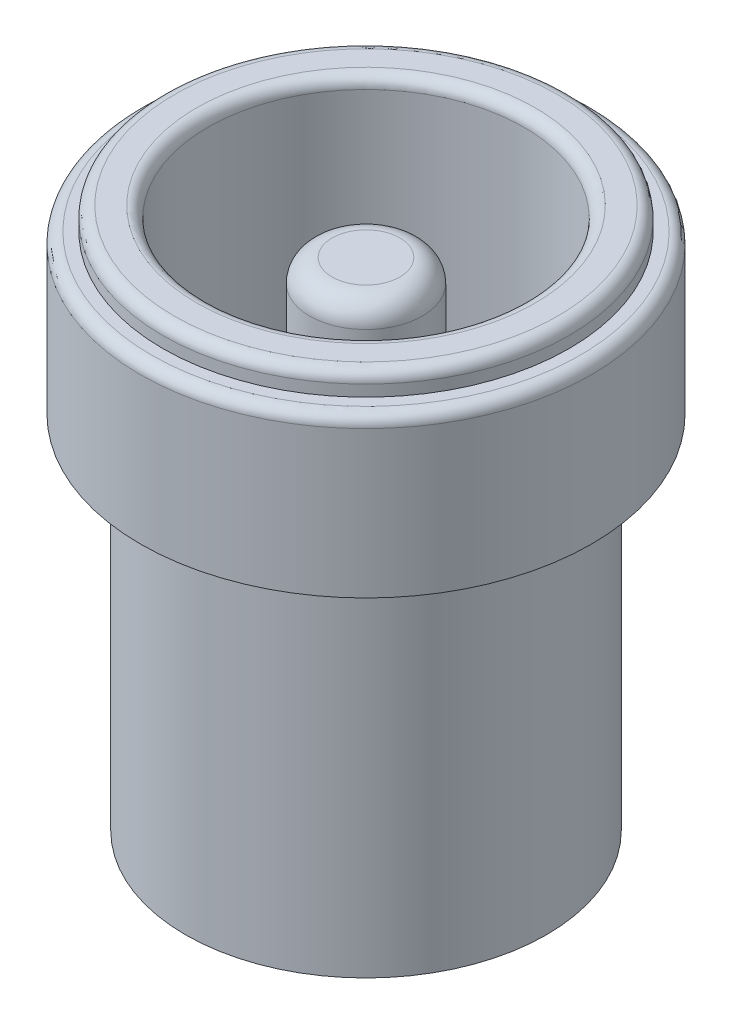
ISO-10303-21;
HEADER;
FILE_DESCRIPTION(('STEP AP214'),'2;1');
FILE_NAME('part.step','',(''),(''),'','','');
FILE_SCHEMA(('AUTOMOTIVE_DESIGN { 1 0 10303 214 1 1 1 1 }'));
ENDSEC;
DATA;
#1=APPLICATION_CONTEXT('core data for automotive mechanical design processes');
#2=APPLICATION_PROTOCOL_DEFINITION('international standard','automotive_design',2000,#1);
#3=PRODUCT_CONTEXT('',#1,'mechanical');
#4=PRODUCT('Part','Part','',(#3));
#5=PRODUCT_RELATED_PRODUCT_CATEGORY('part','',(#4));
#6=PRODUCT_DEFINITION_FORMATION('','',#4);
#7=PRODUCT_DEFINITION_CONTEXT('part definition',#1,'design');
#8=PRODUCT_DEFINITION('design','',#6,#7);
#9=PRODUCT_DEFINITION_SHAPE('','',#8);
#10=(LENGTH_UNIT() NAMED_UNIT(*) SI_UNIT(.MILLI.,.METRE.));
#11=(NAMED_UNIT(*) PLANE_ANGLE_UNIT() SI_UNIT($,.RADIAN.));
#12=(NAMED_UNIT(*) SI_UNIT($,.STERADIAN.) SOLID_ANGLE_UNIT());
#13=UNCERTAINTY_MEASURE_WITH_UNIT(LENGTH_MEASURE(1.E-05),#10,'distance_accuracy_value','');
#14=(GEOMETRIC_REPRESENTATION_CONTEXT(3) GLOBAL_UNCERTAINTY_ASSIGNED_CONTEXT((#13)) GLOBAL_UNIT_ASSIGNED_CONTEXT((#10,
#11,#12)) REPRESENTATION_CONTEXT('',''));
#15=CARTESIAN_POINT('',(0.,0.,0.));
#16=DIRECTION('',(0.,0.,1.));
#17=DIRECTION('',(1.,0.,0.));
#18=AXIS2_PLACEMENT_3D('',#15,#16,#17);
#19=CARTESIAN_POINT('',(0.,-10.,0.));
#20=DIRECTION('',(0.,1.,0.));
#21=DIRECTION('',(0.,0.,1.));
#22=AXIS2_PLACEMENT_3D('',#19,#20,#21);
#23=CYLINDRICAL_SURFACE('',#22,1.25);
#24=CARTESIAN_POINT('',(0.,-1.5,0.));
#25=DIRECTION('',(0.,1.,0.));
#26=DIRECTION('',(0.,0.,1.));
#27=AXIS2_PLACEMENT_3D('',#24,#25,#26);
#28=CIRCLE('',#27,1.25);
#29=CARTESIAN_POINT('',(0.,-1.5,1.25));
#30=VERTEX_POINT('',#29);
#31=EDGE_CURVE('E79',#30,#30,#28,.F.);
#32=ORIENTED_EDGE('',*,*,#31,.T.);
#33=EDGE_LOOP('',(#32));
#34=FACE_BOUND('',#33,.T.);
#35=CARTESIAN_POINT('',(0.,-10.,0.));
#36=DIRECTION('',(0.,1.,0.));
#37=DIRECTION('',(0.,0.,1.));
#38=AXIS2_PLACEMENT_3D('',#35,#36,#37);
#39=CIRCLE('',#38,1.25);
#40=CARTESIAN_POINT('',(0.,-10.,1.25));
#41=VERTEX_POINT('',#40);
#42=EDGE_CURVE('E103',#41,#41,#39,.T.);
#43=ORIENTED_EDGE('',*,*,#42,.T.);
#44=EDGE_LOOP('',(#43));
#45=FACE_BOUND('',#44,.T.);
#46=ADVANCED_FACE('F39',(#34,#45),#23,.T.);
#47=CARTESIAN_POINT('',(0.,0.,0.));
#48=DIRECTION('',(0.,1.,0.));
#49=DIRECTION('',(0.,0.,1.));
#50=AXIS2_PLACEMENT_3D('',#47,#48,#49);
#51=PLANE('',#50);
#52=CARTESIAN_POINT('',(0.,0.,0.));
#53=DIRECTION('',(0.,1.,0.));
#54=DIRECTION('',(0.,0.,1.));
#55=AXIS2_PLACEMENT_3D('',#52,#53,#54);
#56=CIRCLE('',#55,3.75);
#57=CARTESIAN_POINT('',(0.,0.,3.75));
#58=VERTEX_POINT('',#57);
#59=EDGE_CURVE('E63',#58,#58,#56,.F.);
#60=ORIENTED_EDGE('',*,*,#59,.T.);
#61=EDGE_LOOP('',(#60));
#62=FACE_BOUND('',#61,.T.);
#63=CARTESIAN_POINT('',(0.,0.,0.));
#64=DIRECTION('',(0.,1.,0.));
#65=DIRECTION('',(0.,0.,1.));
#66=AXIS2_PLACEMENT_3D('',#63,#64,#65);
#67=CIRCLE('',#66,4.25);
#68=CARTESIAN_POINT('',(0.,0.,4.25));
#69=VERTEX_POINT('',#68);
#70=EDGE_CURVE('E67',#69,#69,#67,.T.);
#71=ORIENTED_EDGE('',*,*,#70,.T.);
#72=EDGE_LOOP('',(#71));
#73=FACE_BOUND('',#72,.T.);
#74=ADVANCED_FACE('F127',(#62,#73),#51,.T.);
#75=CARTESIAN_POINT('',(0.,-12.,0.));
#76=DIRECTION('',(0.,-1.,0.));
#77=DIRECTION('',(0.,0.,-1.));
#78=AXIS2_PLACEMENT_3D('',#75,#76,#77);
#79=CYLINDRICAL_SURFACE('',#78,4.5);
#80=CARTESIAN_POINT('',(0.,-0.25,0.));
#81=DIRECTION('',(0.,1.,0.));
#82=DIRECTION('',(0.,0.,1.));
#83=AXIS2_PLACEMENT_3D('',#80,#81,#82);
#84=CIRCLE('',#83,4.5);
#85=CARTESIAN_POINT('',(0.,-0.25,4.5));
#86=VERTEX_POINT('',#85);
#87=EDGE_CURVE('E52',#86,#86,#84,.F.);
#88=ORIENTED_EDGE('',*,*,#87,.T.);
#89=EDGE_LOOP('',(#88));
#90=FACE_BOUND('',#89,.T.);
#91=CARTESIAN_POINT('',(0.,-0.5,0.));
#92=DIRECTION('',(0.,-1.,0.));
#93=DIRECTION('',(0.,0.,-1.));
#94=AXIS2_PLACEMENT_3D('',#91,#92,#93);
#95=CIRCLE('',#94,4.5);
#96=CARTESIAN_POINT('',(0.,-0.5,-4.5));
#97=VERTEX_POINT('',#96);
#98=EDGE_CURVE('E87',#97,#97,#95,.T.);
#99=ORIENTED_EDGE('',*,*,#98,.F.);
#100=EDGE_LOOP('',(#99));
#101=FACE_BOUND('',#100,.T.);
#102=ADVANCED_FACE('F132',(#90,#101),#79,.T.);
#103=CARTESIAN_POINT('',(4.5,-0.500000000000001,0.));
#104=DIRECTION('',(0.,1.,0.));
#105=DIRECTION('',(0.,0.,1.));
#106=AXIS2_PLACEMENT_3D('',#103,#104,#105);
#107=PLANE('',#106);
#108=CARTESIAN_POINT('',(0.,-0.500000000000001,0.));
#109=DIRECTION('',(0.,1.,0.));
#110=DIRECTION('',(0.,0.,1.));
#111=AXIS2_PLACEMENT_3D('',#108,#109,#110);
#112=CIRCLE('',#111,4.75);
#113=CARTESIAN_POINT('',(0.,-0.500000000000001,4.75));
#114=VERTEX_POINT('',#113);
#115=EDGE_CURVE('E10',#114,#114,#112,.T.);
#116=ORIENTED_EDGE('',*,*,#115,.T.);
#117=EDGE_LOOP('',(#116));
#118=FACE_BOUND('',#117,.T.);
#119=ORIENTED_EDGE('',*,*,#98,.T.);
#120=EDGE_LOOP('',(#119));
#121=FACE_BOUND('',#120,.T.);
#122=ADVANCED_FACE('F165',(#118,#121),#107,.T.);
#123=CARTESIAN_POINT('',(0.,-12.,0.));
#124=DIRECTION('',(0.,-1.,0.));
#125=DIRECTION('',(0.,0.,-1.));
#126=AXIS2_PLACEMENT_3D('',#123,#124,#125);
#127=CYLINDRICAL_SURFACE('',#126,5.);
#128=CARTESIAN_POINT('',(0.,-0.750000000000001,0.));
#129=DIRECTION('',(0.,1.,0.));
#130=DIRECTION('',(0.,0.,1.));
#131=AXIS2_PLACEMENT_3D('',#128,#129,#130);
#132=CIRCLE('',#131,5.);
#133=CARTESIAN_POINT('',(0.,-0.750000000000001,5.));
#134=VERTEX_POINT('',#133);
#135=EDGE_CURVE('E47',#134,#134,#132,.F.);
#136=ORIENTED_EDGE('',*,*,#135,.T.);
#137=EDGE_LOOP('',(#136));
#138=FACE_BOUND('',#137,.T.);
#139=CARTESIAN_POINT('',(0.,-4.,0.));
#140=DIRECTION('',(0.,-1.,0.));
#141=DIRECTION('',(0.,0.,-1.));
#142=AXIS2_PLACEMENT_3D('',#139,#140,#141);
#143=CIRCLE('',#142,5.);
#144=CARTESIAN_POINT('',(0.,-4.,-5.));
#145=VERTEX_POINT('',#144);
#146=EDGE_CURVE('E91',#145,#145,#143,.T.);
#147=ORIENTED_EDGE('',*,*,#146,.F.);
#148=EDGE_LOOP('',(#147));
#149=FACE_BOUND('',#148,.T.);
#150=ADVANCED_FACE('F169',(#138,#149),#127,.T.);
#151=CARTESIAN_POINT('',(5.,-4.,0.));
#152=DIRECTION('',(0.,-1.,0.));
#153=DIRECTION('',(0.,0.,-1.));
#154=AXIS2_PLACEMENT_3D('',#151,#152,#153);
#155=PLANE('',#154);
#156=ORIENTED_EDGE('',*,*,#146,.T.);
#157=EDGE_LOOP('',(#156));
#158=FACE_BOUND('',#157,.T.);
#159=CARTESIAN_POINT('',(0.,-4.,0.));
#160=DIRECTION('',(0.,-1.,0.));
#161=DIRECTION('',(0.,0.,-1.));
#162=AXIS2_PLACEMENT_3D('',#159,#160,#161);
#163=CIRCLE('',#162,4.);
#164=CARTESIAN_POINT('',(0.,-4.,-4.));
#165=VERTEX_POINT('',#164);
#166=EDGE_CURVE('E95',#165,#165,#163,.T.);
#167=ORIENTED_EDGE('',*,*,#166,.F.);
#168=EDGE_LOOP('',(#167));
#169=FACE_BOUND('',#168,.T.);
#170=ADVANCED_FACE('F174',(#158,#169),#155,.T.);
#171=CARTESIAN_POINT('',(0.,-12.,0.));
#172=DIRECTION('',(0.,-1.,0.));
#173=DIRECTION('',(0.,0.,-1.));
#174=AXIS2_PLACEMENT_3D('',#171,#172,#173);
#175=CYLINDRICAL_SURFACE('',#174,4.);
#176=ORIENTED_EDGE('',*,*,#166,.T.);
#177=EDGE_LOOP('',(#176));
#178=FACE_BOUND('',#177,.T.);
#179=CARTESIAN_POINT('',(0.,-12.,0.));
#180=DIRECTION('',(0.,-1.,0.));
#181=DIRECTION('',(0.,0.,-1.));
#182=AXIS2_PLACEMENT_3D('',#179,#180,#181);
#183=CIRCLE('',#182,4.);
#184=CARTESIAN_POINT('',(0.,-12.,-4.));
#185=VERTEX_POINT('',#184);
#186=EDGE_CURVE('E99',#185,#185,#183,.T.);
#187=ORIENTED_EDGE('',*,*,#186,.F.);
#188=EDGE_LOOP('',(#187));
#189=FACE_BOUND('',#188,.T.);
#190=ADVANCED_FACE('F179',(#178,#189),#175,.T.);
#191=CARTESIAN_POINT('',(4.,-12.,0.));
#192=DIRECTION('',(0.,-1.,0.));
#193=DIRECTION('',(0.,0.,-1.));
#194=AXIS2_PLACEMENT_3D('',#191,#192,#193);
#195=PLANE('',#194);
#196=ORIENTED_EDGE('',*,*,#186,.T.);
#197=EDGE_LOOP('',(#196));
#198=FACE_BOUND('',#197,.T.);
#199=ADVANCED_FACE('F122',(#198),#195,.T.);
#200=CARTESIAN_POINT('',(0.,-10.,0.));
#201=DIRECTION('',(0.,1.,0.));
#202=DIRECTION('',(0.,0.,1.));
#203=AXIS2_PLACEMENT_3D('',#200,#201,#202);
#204=CYLINDRICAL_SURFACE('',#203,3.5);
#205=CARTESIAN_POINT('',(0.,-0.25,0.));
#206=DIRECTION('',(0.,1.,0.));
#207=DIRECTION('',(0.,0.,1.));
#208=AXIS2_PLACEMENT_3D('',#205,#206,#207);
#209=CIRCLE('',#208,3.5);
#210=CARTESIAN_POINT('',(0.,-0.25,3.5));
#211=VERTEX_POINT('',#210);
#212=EDGE_CURVE('E71',#211,#211,#209,.T.);
#213=ORIENTED_EDGE('',*,*,#212,.T.);
#214=EDGE_LOOP('',(#213));
#215=FACE_BOUND('',#214,.T.);
#216=CARTESIAN_POINT('',(0.,-9.75,0.));
#217=DIRECTION('',(0.,1.,0.));
#218=DIRECTION('',(0.,0.,1.));
#219=AXIS2_PLACEMENT_3D('',#216,#217,#218);
#220=CIRCLE('',#219,3.5);
#221=CARTESIAN_POINT('',(0.,-9.75,3.5));
#222=VERTEX_POINT('',#221);
#223=EDGE_CURVE('E75',#222,#222,#220,.F.);
#224=ORIENTED_EDGE('',*,*,#223,.T.);
#225=EDGE_LOOP('',(#224));
#226=FACE_BOUND('',#225,.T.);
#227=ADVANCED_FACE('F112',(#215,#226),#204,.F.);
#228=CARTESIAN_POINT('',(0.,-10.,0.));
#229=DIRECTION('',(0.,1.,0.));
#230=DIRECTION('',(0.,0.,1.));
#231=AXIS2_PLACEMENT_3D('',#228,#229,#230);
#232=PLANE('',#231);
#233=CARTESIAN_POINT('',(0.,-10.,0.));
#234=DIRECTION('',(0.,1.,0.));
#235=DIRECTION('',(0.,0.,1.));
#236=AXIS2_PLACEMENT_3D('',#233,#234,#235);
#237=CIRCLE('',#236,3.25);
#238=CARTESIAN_POINT('',(0.,-10.,3.25));
#239=VERTEX_POINT('',#238);
#240=EDGE_CURVE('E57',#239,#239,#237,.T.);
#241=ORIENTED_EDGE('',*,*,#240,.T.);
#242=EDGE_LOOP('',(#241));
#243=FACE_BOUND('',#242,.T.);
#244=ORIENTED_EDGE('',*,*,#42,.F.);
#245=EDGE_LOOP('',(#244));
#246=FACE_BOUND('',#245,.T.);
#247=ADVANCED_FACE('F109',(#243,#246),#232,.T.);
#248=CARTESIAN_POINT('',(0.,-1.,0.));
#249=DIRECTION('',(0.,1.,0.));
#250=DIRECTION('',(0.,0.,1.));
#251=AXIS2_PLACEMENT_3D('',#248,#249,#250);
#252=PLANE('',#251);
#253=CARTESIAN_POINT('',(0.,-1.,0.));
#254=DIRECTION('',(0.,1.,0.));
#255=DIRECTION('',(0.,0.,1.));
#256=AXIS2_PLACEMENT_3D('',#253,#254,#255);
#257=CIRCLE('',#256,0.75);
#258=CARTESIAN_POINT('',(0.,-1.,0.75));
#259=VERTEX_POINT('',#258);
#260=EDGE_CURVE('E83',#259,#259,#257,.T.);
#261=ORIENTED_EDGE('',*,*,#260,.T.);
#262=EDGE_LOOP('',(#261));
#263=FACE_BOUND('',#262,.T.);
#264=ADVANCED_FACE('F111',(#263),#252,.T.);
#265=CARTESIAN_POINT('',(0.,-1.5,0.));
#266=DIRECTION('',(0.,1.,0.));
#267=DIRECTION('',(0.,0.,1.));
#268=AXIS2_PLACEMENT_3D('',#265,#266,#267);
#269=TOROIDAL_SURFACE('',#268,0.75,0.5);
#270=ORIENTED_EDGE('',*,*,#31,.F.);
#271=EDGE_LOOP('',(#270));
#272=FACE_BOUND('',#271,.T.);
#273=ORIENTED_EDGE('',*,*,#260,.F.);
#274=EDGE_LOOP('',(#273));
#275=FACE_BOUND('',#274,.T.);
#276=ADVANCED_FACE('F119',(#272,#275),#269,.T.);
#277=CARTESIAN_POINT('',(0.,-0.25,0.));
#278=DIRECTION('',(0.,1.,0.));
#279=DIRECTION('',(0.,0.,1.));
#280=AXIS2_PLACEMENT_3D('',#277,#278,#279);
#281=TOROIDAL_SURFACE('',#280,3.75,0.25);
#282=ORIENTED_EDGE('',*,*,#59,.F.);
#283=EDGE_LOOP('',(#282));
#284=FACE_BOUND('',#283,.T.);
#285=ORIENTED_EDGE('',*,*,#212,.F.);
#286=EDGE_LOOP('',(#285));
#287=FACE_BOUND('',#286,.T.);
#288=ADVANCED_FACE('F139',(#284,#287),#281,.T.);
#289=CARTESIAN_POINT('',(0.,-9.75,0.));
#290=DIRECTION('',(0.,1.,0.));
#291=DIRECTION('',(0.,0.,1.));
#292=AXIS2_PLACEMENT_3D('',#289,#290,#291);
#293=TOROIDAL_SURFACE('',#292,3.25,0.25);
#294=ORIENTED_EDGE('',*,*,#223,.F.);
#295=EDGE_LOOP('',(#294));
#296=FACE_BOUND('',#295,.T.);
#297=ORIENTED_EDGE('',*,*,#240,.F.);
#298=EDGE_LOOP('',(#297));
#299=FACE_BOUND('',#298,.T.);
#300=ADVANCED_FACE('F145',(#296,#299),#293,.F.);
#301=CARTESIAN_POINT('',(0.,-0.25,0.));
#302=DIRECTION('',(0.,1.,0.));
#303=DIRECTION('',(0.,0.,1.));
#304=AXIS2_PLACEMENT_3D('',#301,#302,#303);
#305=TOROIDAL_SURFACE('',#304,4.25,0.25);
#306=ORIENTED_EDGE('',*,*,#70,.F.);
#307=EDGE_LOOP('',(#306));
#308=FACE_BOUND('',#307,.T.);
#309=ORIENTED_EDGE('',*,*,#87,.F.);
#310=EDGE_LOOP('',(#309));
#311=FACE_BOUND('',#310,.T.);
#312=ADVANCED_FACE('F151',(#308,#311),#305,.T.);
#313=CARTESIAN_POINT('',(0.,-0.750000000000001,0.));
#314=DIRECTION('',(0.,1.,0.));
#315=DIRECTION('',(0.,0.,1.));
#316=AXIS2_PLACEMENT_3D('',#313,#314,#315);
#317=TOROIDAL_SURFACE('',#316,4.75,0.25);
#318=ORIENTED_EDGE('',*,*,#115,.F.);
#319=EDGE_LOOP('',(#318));
#320=FACE_BOUND('',#319,.T.);
#321=ORIENTED_EDGE('',*,*,#135,.F.);
#322=EDGE_LOOP('',(#321));
#323=FACE_BOUND('',#322,.T.);
#324=ADVANCED_FACE('F41',(#320,#323),#317,.T.);
#325=CLOSED_SHELL('',(#46,#74,#102,#122,#150,#170,#190,#199,#227,#247,#264,#276,#288,#300,#312,#324));
#326=MANIFOLD_SOLID_BREP('B2',#325);
#327=ADVANCED_BREP_SHAPE_REPRESENTATION('',(#18,#326),#14);
#328=SHAPE_DEFINITION_REPRESENTATION(#9,#327);
ENDSEC;
END-ISO-10303-21;
